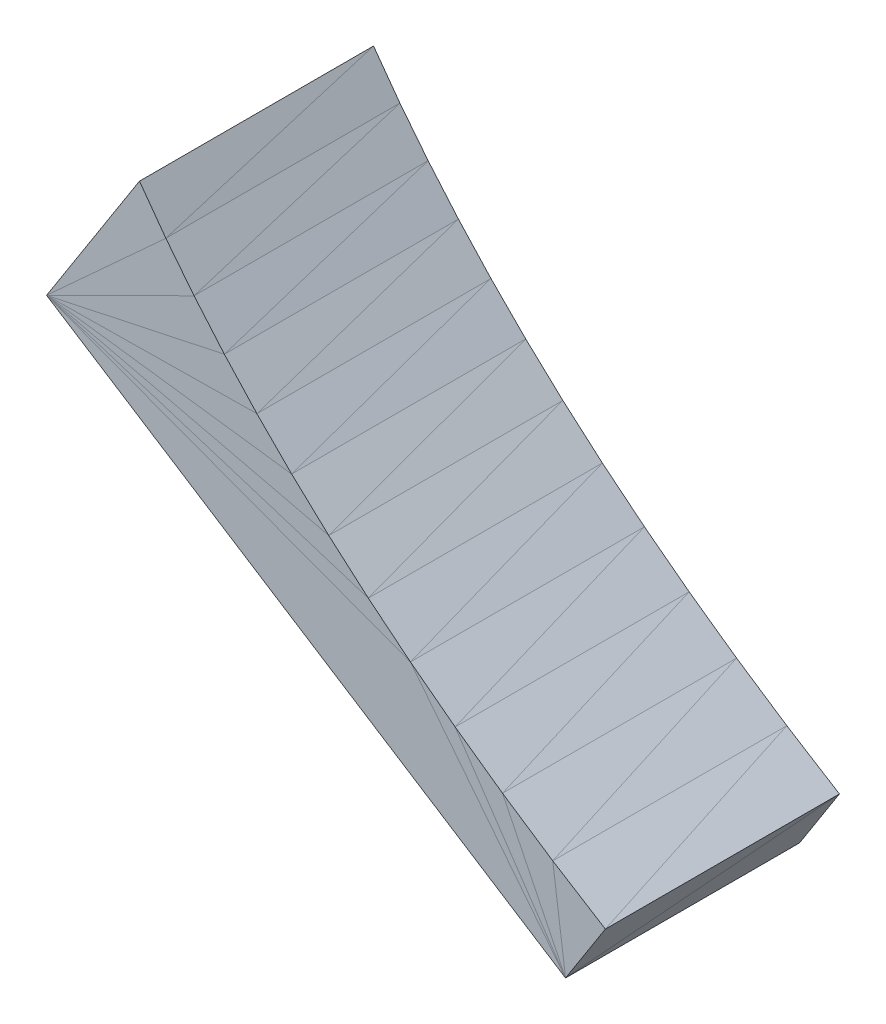
ISO-10303-21;
HEADER;
FILE_DESCRIPTION(('STEP AP214'),'2;1');
FILE_NAME('part.step','',(''),(''),'','','');
FILE_SCHEMA(('AUTOMOTIVE_DESIGN { 1 0 10303 214 1 1 1 1 }'));
ENDSEC;
DATA;
#1=APPLICATION_CONTEXT('core data for automotive mechanical design processes');
#2=APPLICATION_PROTOCOL_DEFINITION('international standard','automotive_design',2000,#1);
#3=PRODUCT_CONTEXT('',#1,'mechanical');
#4=PRODUCT('Part','Part','',(#3));
#5=PRODUCT_RELATED_PRODUCT_CATEGORY('part','',(#4));
#6=PRODUCT_DEFINITION_FORMATION('','',#4);
#7=PRODUCT_DEFINITION_CONTEXT('part definition',#1,'design');
#8=PRODUCT_DEFINITION('design','',#6,#7);
#9=PRODUCT_DEFINITION_SHAPE('','',#8);
#10=(LENGTH_UNIT() NAMED_UNIT(*) SI_UNIT(.MILLI.,.METRE.));
#11=(NAMED_UNIT(*) PLANE_ANGLE_UNIT() SI_UNIT($,.RADIAN.));
#12=(NAMED_UNIT(*) SI_UNIT($,.STERADIAN.) SOLID_ANGLE_UNIT());
#13=UNCERTAINTY_MEASURE_WITH_UNIT(LENGTH_MEASURE(1.E-05),#10,'distance_accuracy_value','');
#14=(GEOMETRIC_REPRESENTATION_CONTEXT(3) GLOBAL_UNCERTAINTY_ASSIGNED_CONTEXT((#13)) GLOBAL_UNIT_ASSIGNED_CONTEXT((#10,
#11,#12)) REPRESENTATION_CONTEXT('',''));
#15=CARTESIAN_POINT('',(0.,0.,0.));
#16=DIRECTION('',(0.,0.,1.));
#17=DIRECTION('',(1.,0.,0.));
#18=AXIS2_PLACEMENT_3D('',#15,#16,#17);
#19=CARTESIAN_POINT('',(0.,0.,9.80002526193857));
#20=DIRECTION('',(0.,0.,-1.));
#21=DIRECTION('',(-1.,0.,0.));
#22=AXIS2_PLACEMENT_3D('',#19,#20,#21);
#23=PLANE('',#22);
#24=DIRECTION('',(-0.562816122617644,0.826582126664763,0.));
#25=VECTOR('',#24,1.);
#26=CARTESIAN_POINT('',(52.4950847029686,22.8988844901323,9.80002526193857));
#27=LINE('',#26,#25);
#28=CARTESIAN_POINT('',(52.4950847029686,22.8988844901323,9.80002526193857));
#29=VERTEX_POINT('',#28);
#30=CARTESIAN_POINT('',(48.0125844478607,29.4821262359619,9.80002526193857));
#31=VERTEX_POINT('',#30);
#32=EDGE_CURVE('E19',#29,#31,#27,.T.);
#33=ORIENTED_EDGE('',*,*,#32,.F.);
#34=DIRECTION('',(0.440328471800176,-0.897836754049489,0.));
#35=VECTOR('',#34,1.);
#36=CARTESIAN_POINT('',(49.9370917677879,28.1146727502346,9.80002526193857));
#37=LINE('',#36,#35);
#38=CARTESIAN_POINT('',(49.9370917677879,28.1146727502346,9.80002526193857));
#39=VERTEX_POINT('',#38);
#40=EDGE_CURVE('E128',#39,#29,#37,.T.);
#41=ORIENTED_EDGE('',*,*,#40,.F.);
#42=DIRECTION('',(0.815172330421562,-0.579218500839778,0.));
#43=VECTOR('',#42,1.);
#44=CARTESIAN_POINT('',(48.0125844478607,29.4821262359619,9.80002526193857));
#45=LINE('',#44,#43);
#46=EDGE_CURVE('E131',#31,#39,#45,.T.);
#47=ORIENTED_EDGE('',*,*,#46,.F.);
#48=EDGE_LOOP('',(#33,#41,#47));
#49=FACE_BOUND('',#48,.T.);
#50=ADVANCED_FACE('F16',(#49),#23,.F.);
#51=CARTESIAN_POINT('',(0.,0.,9.80002526193857));
#52=DIRECTION('',(0.,0.,-1.));
#53=DIRECTION('',(-1.,0.,0.));
#54=AXIS2_PLACEMENT_3D('',#51,#52,#53);
#55=PLANE('',#54);
#56=DIRECTION('',(0.796350239952052,-0.604835758969581,0.));
#57=VECTOR('',#56,1.);
#58=CARTESIAN_POINT('',(46.1983643472195,30.8600440621376,9.80002526193857));
#59=LINE('',#58,#57);
#60=CARTESIAN_POINT('',(46.1983643472195,30.8600440621376,9.80002526193857));
#61=VERTEX_POINT('',#60);
#62=EDGE_CURVE('E138',#61,#31,#59,.T.);
#63=ORIENTED_EDGE('',*,*,#62,.F.);
#64=DIRECTION('',(-0.620347723781328,0.784326909903852,0.));
#65=VECTOR('',#64,1.);
#66=CARTESIAN_POINT('',(52.4950847029686,22.8988844901323,9.80002526193857));
#67=LINE('',#66,#65);
#68=EDGE_CURVE('E135',#29,#61,#67,.T.);
#69=ORIENTED_EDGE('',*,*,#68,.F.);
#70=ORIENTED_EDGE('',*,*,#32,.T.);
#71=EDGE_LOOP('',(#63,#69,#70));
#72=FACE_BOUND('',#71,.T.);
#73=ADVANCED_FACE('F136',(#72),#55,.F.);
#74=CARTESIAN_POINT('',(0.,0.,9.80002526193857));
#75=DIRECTION('',(0.,0.,-1.));
#76=DIRECTION('',(-1.,0.,0.));
#77=AXIS2_PLACEMENT_3D('',#74,#75,#76);
#78=PLANE('',#77);
#79=ORIENTED_EDGE('',*,*,#40,.T.);
#80=DIRECTION('',(0.133329549385269,-0.991071758885663,0.));
#81=VECTOR('',#80,1.);
#82=CARTESIAN_POINT('',(51.9758947193623,26.7581529915333,9.80002526193857));
#83=LINE('',#82,#81);
#84=CARTESIAN_POINT('',(51.9758947193623,26.7581529915333,9.80002526193857));
#85=VERTEX_POINT('',#84);
#86=EDGE_CURVE('E142',#85,#29,#83,.T.);
#87=ORIENTED_EDGE('',*,*,#86,.F.);
#88=DIRECTION('',(0.832555468926433,-0.553941685704089,0.));
#89=VECTOR('',#88,1.);
#90=CARTESIAN_POINT('',(49.9370917677879,28.1146727502346,9.80002526193857));
#91=LINE('',#90,#89);
#92=EDGE_CURVE('E150',#39,#85,#91,.T.);
#93=ORIENTED_EDGE('',*,*,#92,.F.);
#94=EDGE_LOOP('',(#79,#87,#93));
#95=FACE_BOUND('',#94,.T.);
#96=ADVANCED_FACE('F146',(#95),#78,.F.);
#97=CARTESIAN_POINT('',(0.,0.,9.80002526193857));
#98=DIRECTION('',(0.,0.,1.));
#99=DIRECTION('',(1.,0.,0.));
#100=AXIS2_PLACEMENT_3D('',#97,#98,#99);
#101=PLANE('',#100);
#102=ORIENTED_EDGE('',*,*,#68,.T.);
#103=DIRECTION('',(0.937029478100123,-0.349250278699117,0.));
#104=VECTOR('',#103,1.);
#105=CARTESIAN_POINT('',(31.4311720430851,36.3640822470188,9.80002526193857));
#106=LINE('',#105,#104);
#107=CARTESIAN_POINT('',(31.4311720430851,36.3640822470188,9.80002526193857));
#108=VERTEX_POINT('',#107);
#109=EDGE_CURVE('E154',#108,#61,#106,.T.);
#110=ORIENTED_EDGE('',*,*,#109,.F.);
#111=DIRECTION('',(-0.842556528520699,0.538607924419191,0.));
#112=VECTOR('',#111,1.);
#113=CARTESIAN_POINT('',(52.4950847029686,22.8988844901323,9.80002526193857));
#114=LINE('',#113,#112);
#115=EDGE_CURVE('E152',#29,#108,#114,.T.);
#116=ORIENTED_EDGE('',*,*,#115,.F.);
#117=EDGE_LOOP('',(#102,#110,#116));
#118=FACE_BOUND('',#117,.T.);
#119=ADVANCED_FACE('F153',(#118),#101,.T.);
#120=CARTESIAN_POINT('',(0.,0.,9.80002526193857));
#121=DIRECTION('',(0.,0.,1.));
#122=DIRECTION('',(1.,0.,0.));
#123=AXIS2_PLACEMENT_3D('',#120,#121,#122);
#124=PLANE('',#123);
#125=DIRECTION('',(-0.538607657060364,-0.842556699430932,0.));
#126=VECTOR('',#125,1.);
#127=CARTESIAN_POINT('',(54.1109070181847,25.4265535622835,9.80002526193857));
#128=LINE('',#127,#126);
#129=CARTESIAN_POINT('',(54.1109070181847,25.4265535622835,9.80002526193857));
#130=VERTEX_POINT('',#129);
#131=EDGE_CURVE('E158',#130,#29,#128,.T.);
#132=ORIENTED_EDGE('',*,*,#131,.F.);
#133=DIRECTION('',(0.848495063642009,-0.529203294561876,0.));
#134=VECTOR('',#133,1.);
#135=CARTESIAN_POINT('',(51.9758947193623,26.7581529915333,9.80002526193857));
#136=LINE('',#135,#134);
#137=EDGE_CURVE('E166',#85,#130,#136,.T.);
#138=ORIENTED_EDGE('',*,*,#137,.F.);
#139=ORIENTED_EDGE('',*,*,#86,.T.);
#140=EDGE_LOOP('',(#132,#138,#139));
#141=FACE_BOUND('',#140,.T.);
#142=ADVANCED_FACE('F162',(#141),#124,.T.);
#143=CARTESIAN_POINT('',(25.6204334732577,40.078622143745,0.));
#144=DIRECTION('',(0.538607924419191,0.842556528520699,0.));
#145=DIRECTION('',(-0.842556528520699,0.538607924419191,0.));
#146=AXIS2_PLACEMENT_3D('',#143,#144,#145);
#147=PLANE('',#146);
#148=ORIENTED_EDGE('',*,*,#115,.T.);
#149=DIRECTION('',(-0.787608007337806,0.503481843328604,0.35521776449919));
#150=VECTOR('',#149,1.);
#151=CARTESIAN_POINT('',(52.4950847029686,22.8988844901323,0.300025392789394));
#152=LINE('',#151,#150);
#153=CARTESIAN_POINT('',(52.4950847029686,22.8988844901323,0.300025392789393));
#154=VERTEX_POINT('',#153);
#155=EDGE_CURVE('E172',#154,#108,#152,.T.);
#156=ORIENTED_EDGE('',*,*,#155,.F.);
#157=DIRECTION('',(0.,0.,-1.));
#158=VECTOR('',#157,1.);
#159=CARTESIAN_POINT('',(52.4950847029686,22.8988844901323,9.80002526193857));
#160=LINE('',#159,#158);
#161=EDGE_CURVE('E169',#29,#154,#160,.T.);
#162=ORIENTED_EDGE('',*,*,#161,.F.);
#163=EDGE_LOOP('',(#148,#156,#162));
#164=FACE_BOUND('',#163,.T.);
#165=ADVANCED_FACE('F170',(#164),#147,.F.);
#166=CARTESIAN_POINT('',(0.,0.,0.300025392789394));
#167=DIRECTION('',(0.,0.,1.));
#168=DIRECTION('',(1.,0.,0.));
#169=AXIS2_PLACEMENT_3D('',#166,#167,#168);
#170=PLANE('',#169);
#171=DIRECTION('',(0.538607657060364,0.842556699430932,0.));
#172=VECTOR('',#171,1.);
#173=CARTESIAN_POINT('',(52.4950847029686,22.8988844901323,0.300025392789394));
#174=LINE('',#173,#172);
#175=CARTESIAN_POINT('',(54.1109070181847,25.4265535622835,0.300025392789394));
#176=VERTEX_POINT('',#175);
#177=EDGE_CURVE('E175',#154,#176,#174,.T.);
#178=ORIENTED_EDGE('',*,*,#177,.F.);
#179=DIRECTION('',(0.133329549385269,-0.991071758885663,0.));
#180=VECTOR('',#179,1.);
#181=CARTESIAN_POINT('',(51.9758947193623,26.7581529915333,0.300025392789394));
#182=LINE('',#181,#180);
#183=CARTESIAN_POINT('',(51.9758947193623,26.7581529915333,0.300025392789394));
#184=VERTEX_POINT('',#183);
#185=EDGE_CURVE('E229',#184,#154,#182,.T.);
#186=ORIENTED_EDGE('',*,*,#185,.F.);
#187=DIRECTION('',(-0.848495063642009,0.529203294561876,0.));
#188=VECTOR('',#187,1.);
#189=CARTESIAN_POINT('',(54.1109070181847,25.4265535622835,0.300025392789394));
#190=LINE('',#189,#188);
#191=EDGE_CURVE('E120',#176,#184,#190,.T.);
#192=ORIENTED_EDGE('',*,*,#191,.F.);
#193=EDGE_LOOP('',(#178,#186,#192));
#194=FACE_BOUND('',#193,.T.);
#195=ADVANCED_FACE('F873',(#194),#170,.F.);
#196=CARTESIAN_POINT('',(26.8746693988494,-17.1797372556204,0.));
#197=DIRECTION('',(-0.842556699430932,0.538607657060364,0.));
#198=DIRECTION('',(-0.538607657060364,-0.842556699430932,0.));
#199=AXIS2_PLACEMENT_3D('',#196,#197,#198);
#200=PLANE('',#199);
#201=ORIENTED_EDGE('',*,*,#131,.T.);
#202=DIRECTION('',(-0.162191602710239,-0.253720160980994,0.953582699047158));
#203=VECTOR('',#202,1.);
#204=CARTESIAN_POINT('',(54.1109070181847,25.4265535622835,0.300025392789394));
#205=LINE('',#204,#203);
#206=EDGE_CURVE('E180',#176,#29,#205,.T.);
#207=ORIENTED_EDGE('',*,*,#206,.F.);
#208=DIRECTION('',(0.,0.,-1.));
#209=VECTOR('',#208,1.);
#210=CARTESIAN_POINT('',(54.1109070181847,25.4265535622835,9.80002526193857));
#211=LINE('',#210,#209);
#212=EDGE_CURVE('E182',#130,#176,#211,.T.);
#213=ORIENTED_EDGE('',*,*,#212,.F.);
#214=EDGE_LOOP('',(#201,#207,#213));
#215=FACE_BOUND('',#214,.T.);
#216=ADVANCED_FACE('F179',(#215),#200,.F.);
#217=CARTESIAN_POINT('',(26.8746693988494,-17.1797372556204,0.));
#218=DIRECTION('',(0.842556699430932,-0.538607657060364,0.));
#219=DIRECTION('',(0.538607657060364,0.842556699430932,0.));
#220=AXIS2_PLACEMENT_3D('',#217,#218,#219);
#221=PLANE('',#220);
#222=ORIENTED_EDGE('',*,*,#161,.T.);
#223=ORIENTED_EDGE('',*,*,#177,.T.);
#224=ORIENTED_EDGE('',*,*,#206,.T.);
#225=EDGE_LOOP('',(#222,#223,#224));
#226=FACE_BOUND('',#225,.T.);
#227=ADVANCED_FACE('F184',(#226),#221,.T.);
#228=CARTESIAN_POINT('',(26.571284427366,42.6029163138774,0.));
#229=DIRECTION('',(-0.529203294561876,-0.848495063642009,0.));
#230=DIRECTION('',(0.848495063642009,-0.529203294561876,0.));
#231=AXIS2_PLACEMENT_3D('',#228,#229,#230);
#232=PLANE('',#231);
#233=ORIENTED_EDGE('',*,*,#191,.T.);
#234=DIRECTION('',(-0.217246886395359,0.135496095310509,-0.966666746354258));
#235=VECTOR('',#234,1.);
#236=CARTESIAN_POINT('',(54.1109070181847,25.4265535622835,9.80002526193857));
#237=LINE('',#236,#235);
#238=EDGE_CURVE('E191',#130,#184,#237,.T.);
#239=ORIENTED_EDGE('',*,*,#238,.F.);
#240=ORIENTED_EDGE('',*,*,#212,.T.);
#241=EDGE_LOOP('',(#233,#239,#240));
#242=FACE_BOUND('',#241,.T.);
#243=ADVANCED_FACE('F849',(#242),#232,.F.);
#244=CARTESIAN_POINT('',(26.571284427366,42.6029163138774,0.));
#245=DIRECTION('',(-0.529203294561876,-0.848495063642009,0.));
#246=DIRECTION('',(0.848495063642009,-0.529203294561876,0.));
#247=AXIS2_PLACEMENT_3D('',#244,#245,#246);
#248=PLANE('',#247);
#249=ORIENTED_EDGE('',*,*,#238,.T.);
#250=DIRECTION('',(0.,0.,-1.));
#251=VECTOR('',#250,1.);
#252=CARTESIAN_POINT('',(51.9758947193623,26.7581529915333,9.80002526193857));
#253=LINE('',#252,#251);
#254=EDGE_CURVE('E194',#85,#184,#253,.T.);
#255=ORIENTED_EDGE('',*,*,#254,.F.);
#256=ORIENTED_EDGE('',*,*,#137,.T.);
#257=EDGE_LOOP('',(#249,#255,#256));
#258=FACE_BOUND('',#257,.T.);
#259=ADVANCED_FACE('F841',(#258),#248,.F.);
#260=CARTESIAN_POINT('',(0.,0.,9.80002526193857));
#261=DIRECTION('',(0.,0.,1.));
#262=DIRECTION('',(1.,0.,0.));
#263=AXIS2_PLACEMENT_3D('',#260,#261,#262);
#264=PLANE('',#263);
#265=DIRECTION('',(-0.953751117925207,0.300597413589036,0.));
#266=VECTOR('',#265,1.);
#267=CARTESIAN_POINT('',(44.4904379546642,32.248143106699,9.80002526193857));
#268=LINE('',#267,#266);
#269=CARTESIAN_POINT('',(44.4904379546642,32.248143106699,9.80002526193857));
#270=VERTEX_POINT('',#269);
#271=EDGE_CURVE('E210',#270,#108,#268,.T.);
#272=ORIENTED_EDGE('',*,*,#271,.F.);
#273=DIRECTION('',(0.754132166692494,-0.656722677512879,0.));
#274=VECTOR('',#273,1.);
#275=CARTESIAN_POINT('',(42.884960770607,33.6462445557117,9.80002526193857));
#276=LINE('',#275,#274);
#277=CARTESIAN_POINT('',(42.884960770607,33.6462445557117,9.80002526193857));
#278=VERTEX_POINT('',#277);
#279=EDGE_CURVE('E204',#278,#270,#276,.T.);
#280=ORIENTED_EDGE('',*,*,#279,.F.);
#281=DIRECTION('',(0.972983075413399,-0.230876449554918,0.));
#282=VECTOR('',#281,1.);
#283=CARTESIAN_POINT('',(31.4311720430851,36.3640822470188,9.80002526193857));
#284=LINE('',#283,#282);
#285=EDGE_CURVE('E215',#108,#278,#284,.T.);
#286=ORIENTED_EDGE('',*,*,#285,.F.);
#287=EDGE_LOOP('',(#272,#280,#286));
#288=FACE_BOUND('',#287,.T.);
#289=ADVANCED_FACE('F430',(#288),#264,.T.);
#290=CARTESIAN_POINT('',(36.7772674837996,39.354028005181,0.));
#291=DIRECTION('',(-0.682782876973017,-0.73062134030731,0.));
#292=DIRECTION('',(0.73062134030731,-0.682782876973017,0.));
#293=AXIS2_PLACEMENT_3D('',#290,#291,#292);
#294=PLANE('',#293);
#295=DIRECTION('',(0.154990069644716,-0.144841876107474,0.977240456201642));
#296=VECTOR('',#295,1.);
#297=CARTESIAN_POINT('',(41.3782633841038,35.0542888045311,0.300025392789394));
#298=LINE('',#297,#296);
#299=CARTESIAN_POINT('',(41.3782633841038,35.0542888045311,0.300025392789394));
#300=VERTEX_POINT('',#299);
#301=EDGE_CURVE('E201',#300,#278,#298,.T.);
#302=ORIENTED_EDGE('',*,*,#301,.F.);
#303=DIRECTION('',(0.,0.,-1.));
#304=VECTOR('',#303,1.);
#305=CARTESIAN_POINT('',(41.3782633841038,35.0542888045311,9.80002526193857));
#306=LINE('',#305,#304);
#307=CARTESIAN_POINT('',(41.3782633841038,35.0542888045311,9.80002526193857));
#308=VERTEX_POINT('',#307);
#309=EDGE_CURVE('E218',#308,#300,#306,.T.);
#310=ORIENTED_EDGE('',*,*,#309,.F.);
#311=DIRECTION('',(-0.73062134030731,0.682782876973017,0.));
#312=VECTOR('',#311,1.);
#313=CARTESIAN_POINT('',(42.884960770607,33.6462445557117,9.80002526193857));
#314=LINE('',#313,#312);
#315=EDGE_CURVE('E213',#278,#308,#314,.T.);
#316=ORIENTED_EDGE('',*,*,#315,.F.);
#317=EDGE_LOOP('',(#302,#310,#316));
#318=FACE_BOUND('',#317,.T.);
#319=ADVANCED_FACE('F824',(#318),#294,.F.);
#320=CARTESIAN_POINT('',(28.2893927189361,42.5179928295546,0.));
#321=DIRECTION('',(-0.553941685704089,-0.832555468926433,0.));
#322=DIRECTION('',(0.832555468926433,-0.553941685704089,0.));
#323=AXIS2_PLACEMENT_3D('',#320,#321,#322);
#324=PLANE('',#323);
#325=DIRECTION('',(0.832555468926433,-0.553941685704089,0.));
#326=VECTOR('',#325,1.);
#327=CARTESIAN_POINT('',(49.9370917677879,28.1146727502346,0.300025392789394));
#328=LINE('',#327,#326);
#329=CARTESIAN_POINT('',(49.9370917677879,28.1146727502346,0.300025392789394));
#330=VERTEX_POINT('',#329);
#331=EDGE_CURVE('E226',#330,#184,#328,.T.);
#332=ORIENTED_EDGE('',*,*,#331,.F.);
#333=DIRECTION('',(-0.207817428601511,0.13827155188429,-0.968345441621411));
#334=VECTOR('',#333,1.);
#335=CARTESIAN_POINT('',(51.9758947193623,26.7581529915333,9.80002526193857));
#336=LINE('',#335,#334);
#337=EDGE_CURVE('E198',#85,#330,#336,.T.);
#338=ORIENTED_EDGE('',*,*,#337,.F.);
#339=ORIENTED_EDGE('',*,*,#254,.T.);
#340=EDGE_LOOP('',(#332,#338,#339));
#341=FACE_BOUND('',#340,.T.);
#342=ADVANCED_FACE('F815',(#341),#324,.F.);
#343=CARTESIAN_POINT('',(28.2893927189361,42.5179928295546,0.));
#344=DIRECTION('',(-0.553941685704089,-0.832555468926433,0.));
#345=DIRECTION('',(0.832555468926433,-0.553941685704089,0.));
#346=AXIS2_PLACEMENT_3D('',#343,#344,#345);
#347=PLANE('',#346);
#348=ORIENTED_EDGE('',*,*,#337,.T.);
#349=DIRECTION('',(0.,0.,-1.));
#350=VECTOR('',#349,1.);
#351=CARTESIAN_POINT('',(49.9370917677879,28.1146727502346,9.80002526193857));
#352=LINE('',#351,#350);
#353=EDGE_CURVE('E232',#39,#330,#352,.T.);
#354=ORIENTED_EDGE('',*,*,#353,.F.);
#355=ORIENTED_EDGE('',*,*,#92,.T.);
#356=EDGE_LOOP('',(#348,#354,#355));
#357=FACE_BOUND('',#356,.T.);
#358=ADVANCED_FACE('F806',(#357),#347,.F.);
#359=CARTESIAN_POINT('',(36.7772674837997,39.354028005181,0.));
#360=DIRECTION('',(-0.682782876973017,-0.73062134030731,0.));
#361=DIRECTION('',(0.73062134030731,-0.682782876973017,0.));
#362=AXIS2_PLACEMENT_3D('',#359,#360,#361);
#363=PLANE('',#362);
#364=DIRECTION('',(0.73062134030731,-0.682782876973017,0.));
#365=VECTOR('',#364,1.);
#366=CARTESIAN_POINT('',(41.3782633841038,35.0542888045311,0.300025392789394));
#367=LINE('',#366,#365);
#368=CARTESIAN_POINT('',(42.884960770607,33.6462445557117,0.300025392789394));
#369=VERTEX_POINT('',#368);
#370=EDGE_CURVE('E239',#300,#369,#367,.T.);
#371=ORIENTED_EDGE('',*,*,#370,.F.);
#372=ORIENTED_EDGE('',*,*,#301,.T.);
#373=DIRECTION('',(0.,0.,1.));
#374=VECTOR('',#373,1.);
#375=CARTESIAN_POINT('',(42.884960770607,33.6462445557117,0.300025392789394));
#376=LINE('',#375,#374);
#377=EDGE_CURVE('E205',#369,#278,#376,.T.);
#378=ORIENTED_EDGE('',*,*,#377,.F.);
#379=EDGE_LOOP('',(#371,#372,#378));
#380=FACE_BOUND('',#379,.T.);
#381=ADVANCED_FACE('F798',(#380),#363,.F.);
#382=CARTESIAN_POINT('',(35.1591206306173,40.3741559840534,0.));
#383=DIRECTION('',(-0.656722677512879,-0.754132166692494,0.));
#384=DIRECTION('',(0.754132166692494,-0.656722677512879,0.));
#385=AXIS2_PLACEMENT_3D('',#382,#383,#384);
#386=PLANE('',#385);
#387=DIRECTION('',(0.164907591571215,-0.143606863441231,0.975798419252026));
#388=VECTOR('',#387,1.);
#389=CARTESIAN_POINT('',(42.884960770607,33.6462445557117,0.300025392789394));
#390=LINE('',#389,#388);
#391=EDGE_CURVE('E242',#369,#270,#390,.T.);
#392=ORIENTED_EDGE('',*,*,#391,.F.);
#393=ORIENTED_EDGE('',*,*,#377,.T.);
#394=ORIENTED_EDGE('',*,*,#279,.T.);
#395=EDGE_LOOP('',(#392,#393,#394));
#396=FACE_BOUND('',#395,.T.);
#397=ADVANCED_FACE('F790',(#396),#386,.F.);
#398=CARTESIAN_POINT('',(0.,0.,9.80002526193857));
#399=DIRECTION('',(0.,0.,1.));
#400=DIRECTION('',(1.,0.,0.));
#401=AXIS2_PLACEMENT_3D('',#398,#399,#400);
#402=PLANE('',#401);
#403=DIRECTION('',(0.776023075166139,-0.630704516243295,0.));
#404=VECTOR('',#403,1.);
#405=CARTESIAN_POINT('',(44.4904379546642,32.248143106699,9.80002526193857));
#406=LINE('',#405,#404);
#407=EDGE_CURVE('E246',#270,#61,#406,.T.);
#408=ORIENTED_EDGE('',*,*,#407,.F.);
#409=ORIENTED_EDGE('',*,*,#271,.T.);
#410=ORIENTED_EDGE('',*,*,#109,.T.);
#411=EDGE_LOOP('',(#408,#409,#410));
#412=FACE_BOUND('',#411,.T.);
#413=ADVANCED_FACE('F433',(#412),#402,.T.);
#414=CARTESIAN_POINT('',(0.,0.,9.80002526193857));
#415=DIRECTION('',(0.,0.,-1.));
#416=DIRECTION('',(-1.,0.,0.));
#417=AXIS2_PLACEMENT_3D('',#414,#415,#416);
#418=PLANE('',#417);
#419=DIRECTION('',(0.991441842566592,-0.130549120288733,0.));
#420=VECTOR('',#419,1.);
#421=CARTESIAN_POINT('',(31.4311720430851,36.3640822470188,9.80002526193857));
#422=LINE('',#421,#420);
#423=EDGE_CURVE('E253',#108,#308,#422,.T.);
#424=ORIENTED_EDGE('',*,*,#423,.F.);
#425=ORIENTED_EDGE('',*,*,#285,.T.);
#426=ORIENTED_EDGE('',*,*,#315,.T.);
#427=EDGE_LOOP('',(#424,#425,#426));
#428=FACE_BOUND('',#427,.T.);
#429=ADVANCED_FACE('F427',(#428),#418,.F.);
#430=CARTESIAN_POINT('',(38.3126763068252,38.1342217370074,0.));
#431=DIRECTION('',(-0.708755491784293,-0.70545421741287,0.));
#432=DIRECTION('',(0.70545421741287,-0.708755491784293,0.));
#433=AXIS2_PLACEMENT_3D('',#430,#431,#432);
#434=PLANE('',#433);
#435=DIRECTION('',(0.70545421741287,-0.708755491784293,0.));
#436=VECTOR('',#435,1.);
#437=CARTESIAN_POINT('',(39.966844022274,36.47231310606,0.300025392789394));
#438=LINE('',#437,#436);
#439=CARTESIAN_POINT('',(39.966844022274,36.47231310606,0.300025392789394));
#440=VERTEX_POINT('',#439);
#441=EDGE_CURVE('E256',#440,#300,#438,.T.);
#442=ORIENTED_EDGE('',*,*,#441,.F.);
#443=DIRECTION('',(-0.14538135804653,0.146061691000186,-0.978534742947185));
#444=VECTOR('',#443,1.);
#445=CARTESIAN_POINT('',(41.3782633841038,35.0542888045311,9.80002526193857));
#446=LINE('',#445,#444);
#447=EDGE_CURVE('E223',#308,#440,#446,.T.);
#448=ORIENTED_EDGE('',*,*,#447,.F.);
#449=ORIENTED_EDGE('',*,*,#309,.T.);
#450=EDGE_LOOP('',(#442,#448,#449));
#451=FACE_BOUND('',#450,.T.);
#452=ADVANCED_FACE('F766',(#451),#434,.F.);
#453=CARTESIAN_POINT('',(38.3126763068252,38.1342217370074,0.));
#454=DIRECTION('',(-0.708755491784293,-0.70545421741287,0.));
#455=DIRECTION('',(0.70545421741287,-0.708755491784293,0.));
#456=AXIS2_PLACEMENT_3D('',#453,#454,#455);
#457=PLANE('',#456);
#458=ORIENTED_EDGE('',*,*,#447,.T.);
#459=DIRECTION('',(0.,0.,-1.));
#460=VECTOR('',#459,1.);
#461=CARTESIAN_POINT('',(39.966844022274,36.47231310606,9.80002526193857));
#462=LINE('',#461,#460);
#463=CARTESIAN_POINT('',(39.966844022274,36.47231310606,9.80002526193857));
#464=VERTEX_POINT('',#463);
#465=EDGE_CURVE('E264',#464,#440,#462,.T.);
#466=ORIENTED_EDGE('',*,*,#465,.F.);
#467=DIRECTION('',(-0.70545421741287,0.708755491784293,0.));
#468=VECTOR('',#467,1.);
#469=CARTESIAN_POINT('',(41.3782633841038,35.0542888045311,9.80002526193857));
#470=LINE('',#469,#468);
#471=EDGE_CURVE('E250',#308,#464,#470,.T.);
#472=ORIENTED_EDGE('',*,*,#471,.F.);
#473=EDGE_LOOP('',(#458,#466,#472));
#474=FACE_BOUND('',#473,.T.);
#475=ADVANCED_FACE('F757',(#474),#457,.F.);
#476=CARTESIAN_POINT('',(0.,0.,0.300025392789394));
#477=DIRECTION('',(0.,0.,1.));
#478=DIRECTION('',(1.,0.,0.));
#479=AXIS2_PLACEMENT_3D('',#476,#477,#478);
#480=PLANE('',#479);
#481=ORIENTED_EDGE('',*,*,#185,.T.);
#482=DIRECTION('',(0.440328471800176,-0.897836754049489,0.));
#483=VECTOR('',#482,1.);
#484=CARTESIAN_POINT('',(49.9370917677879,28.1146727502346,0.300025392789394));
#485=LINE('',#484,#483);
#486=EDGE_CURVE('E268',#330,#154,#485,.T.);
#487=ORIENTED_EDGE('',*,*,#486,.F.);
#488=ORIENTED_EDGE('',*,*,#331,.T.);
#489=EDGE_LOOP('',(#481,#487,#488));
#490=FACE_BOUND('',#489,.T.);
#491=ADVANCED_FACE('F748',(#490),#480,.F.);
#492=CARTESIAN_POINT('',(30.0283035288103,42.2608085389135,0.));
#493=DIRECTION('',(-0.579218500839778,-0.815172330421562,0.));
#494=DIRECTION('',(0.815172330421562,-0.579218500839778,0.));
#495=AXIS2_PLACEMENT_3D('',#492,#493,#494);
#496=PLANE('',#495);
#497=DIRECTION('',(0.815172330421562,-0.579218500839778,0.));
#498=VECTOR('',#497,1.);
#499=CARTESIAN_POINT('',(48.0125844478607,29.4821262359619,0.300025392789394));
#500=LINE('',#499,#498);
#501=CARTESIAN_POINT('',(48.0125844478607,29.4821262359619,0.300025392789394));
#502=VERTEX_POINT('',#501);
#503=EDGE_CURVE('E271',#502,#330,#500,.T.);
#504=ORIENTED_EDGE('',*,*,#503,.F.);
#505=DIRECTION('',(-0.196599858665224,0.139693499339573,-0.970481438161019));
#506=VECTOR('',#505,1.);
#507=CARTESIAN_POINT('',(49.9370917677879,28.1146727502346,9.80002526193857));
#508=LINE('',#507,#506);
#509=EDGE_CURVE('E236',#39,#502,#508,.T.);
#510=ORIENTED_EDGE('',*,*,#509,.F.);
#511=ORIENTED_EDGE('',*,*,#353,.T.);
#512=EDGE_LOOP('',(#504,#510,#511));
#513=FACE_BOUND('',#512,.T.);
#514=ADVANCED_FACE('F739',(#513),#496,.F.);
#515=CARTESIAN_POINT('',(30.0283035288103,42.2608085389135,0.));
#516=DIRECTION('',(-0.579218500839778,-0.815172330421562,0.));
#517=DIRECTION('',(0.815172330421562,-0.579218500839778,0.));
#518=AXIS2_PLACEMENT_3D('',#515,#516,#517);
#519=PLANE('',#518);
#520=ORIENTED_EDGE('',*,*,#509,.T.);
#521=DIRECTION('',(0.,0.,-1.));
#522=VECTOR('',#521,1.);
#523=CARTESIAN_POINT('',(48.0125844478607,29.4821262359619,9.80002526193857));
#524=LINE('',#523,#522);
#525=EDGE_CURVE('E274',#31,#502,#524,.T.);
#526=ORIENTED_EDGE('',*,*,#525,.F.);
#527=ORIENTED_EDGE('',*,*,#46,.T.);
#528=EDGE_LOOP('',(#520,#526,#527));
#529=FACE_BOUND('',#528,.T.);
#530=ADVANCED_FACE('F730',(#529),#519,.F.);
#531=CARTESIAN_POINT('',(0.,0.,0.300025392789394));
#532=DIRECTION('',(0.,0.,1.));
#533=DIRECTION('',(1.,0.,0.));
#534=AXIS2_PLACEMENT_3D('',#531,#532,#533);
#535=PLANE('',#534);
#536=DIRECTION('',(0.972983075413399,-0.230876449554918,0.));
#537=VECTOR('',#536,1.);
#538=CARTESIAN_POINT('',(31.4311720430851,36.3640822470188,0.300025392789394));
#539=LINE('',#538,#537);
#540=CARTESIAN_POINT('',(31.4311720430851,36.3640822470188,0.300025392789394));
#541=VERTEX_POINT('',#540);
#542=EDGE_CURVE('E280',#541,#369,#539,.T.);
#543=ORIENTED_EDGE('',*,*,#542,.F.);
#544=DIRECTION('',(-0.991441842566592,0.130549120288733,0.));
#545=VECTOR('',#544,1.);
#546=CARTESIAN_POINT('',(41.3782633841038,35.0542888045311,0.300025392789394));
#547=LINE('',#546,#545);
#548=EDGE_CURVE('E261',#300,#541,#547,.T.);
#549=ORIENTED_EDGE('',*,*,#548,.F.);
#550=ORIENTED_EDGE('',*,*,#370,.T.);
#551=EDGE_LOOP('',(#543,#549,#550));
#552=FACE_BOUND('',#551,.T.);
#553=ADVANCED_FACE('F722',(#552),#535,.F.);
#554=CARTESIAN_POINT('',(35.1591206306173,40.3741559840534,0.));
#555=DIRECTION('',(-0.656722677512879,-0.754132166692494,0.));
#556=DIRECTION('',(0.754132166692494,-0.656722677512879,0.));
#557=AXIS2_PLACEMENT_3D('',#554,#555,#556);
#558=PLANE('',#557);
#559=DIRECTION('',(0.754132166692494,-0.656722677512879,0.));
#560=VECTOR('',#559,1.);
#561=CARTESIAN_POINT('',(42.884960770607,33.6462445557117,0.300025392789394));
#562=LINE('',#561,#560);
#563=CARTESIAN_POINT('',(44.4904379546642,32.248143106699,0.300025392789394));
#564=VERTEX_POINT('',#563);
#565=EDGE_CURVE('E285',#369,#564,#562,.T.);
#566=ORIENTED_EDGE('',*,*,#565,.F.);
#567=ORIENTED_EDGE('',*,*,#391,.T.);
#568=DIRECTION('',(0.,0.,1.));
#569=VECTOR('',#568,1.);
#570=CARTESIAN_POINT('',(44.4904379546642,32.248143106699,0.300025392789394));
#571=LINE('',#570,#569);
#572=EDGE_CURVE('E247',#564,#270,#571,.T.);
#573=ORIENTED_EDGE('',*,*,#572,.F.);
#574=EDGE_LOOP('',(#566,#567,#573));
#575=FACE_BOUND('',#574,.T.);
#576=ADVANCED_FACE('F440',(#575),#558,.F.);
#577=CARTESIAN_POINT('',(31.7646593035355,41.8225835414567,0.));
#578=DIRECTION('',(-0.604835758969581,-0.796350239952052,0.));
#579=DIRECTION('',(0.796350239952052,-0.604835758969581,0.));
#580=AXIS2_PLACEMENT_3D('',#577,#578,#579);
#581=PLANE('',#580);
#582=DIRECTION('',(0.18570544861319,-0.141045095890858,0.972429826404205));
#583=VECTOR('',#582,1.);
#584=CARTESIAN_POINT('',(46.1983643472195,30.8600440621376,0.300025392789394));
#585=LINE('',#584,#583);
#586=CARTESIAN_POINT('',(46.1983643472195,30.8600440621376,0.300025392789394));
#587=VERTEX_POINT('',#586);
#588=EDGE_CURVE('E277',#587,#31,#585,.T.);
#589=ORIENTED_EDGE('',*,*,#588,.F.);
#590=DIRECTION('',(0.,0.,-1.));
#591=VECTOR('',#590,1.);
#592=CARTESIAN_POINT('',(46.1983643472195,30.8600440621376,9.80002526193857));
#593=LINE('',#592,#591);
#594=EDGE_CURVE('E288',#61,#587,#593,.T.);
#595=ORIENTED_EDGE('',*,*,#594,.F.);
#596=ORIENTED_EDGE('',*,*,#62,.T.);
#597=EDGE_LOOP('',(#589,#595,#596));
#598=FACE_BOUND('',#597,.T.);
#599=ADVANCED_FACE('F706',(#598),#581,.F.);
#600=CARTESIAN_POINT('',(33.4813423816367,41.1956686634306,0.));
#601=DIRECTION('',(-0.630704516243295,-0.776023075166139,0.));
#602=DIRECTION('',(0.776023075166139,-0.630704516243295,0.));
#603=AXIS2_PLACEMENT_3D('',#600,#601,#602);
#604=PLANE('',#603);
#605=DIRECTION('',(0.175143079781094,-0.142345678809933,0.974198444532187));
#606=VECTOR('',#605,1.);
#607=CARTESIAN_POINT('',(44.4904379546642,32.248143106699,0.300025392789394));
#608=LINE('',#607,#606);
#609=EDGE_CURVE('E289',#564,#61,#608,.T.);
#610=ORIENTED_EDGE('',*,*,#609,.F.);
#611=ORIENTED_EDGE('',*,*,#572,.T.);
#612=ORIENTED_EDGE('',*,*,#407,.T.);
#613=EDGE_LOOP('',(#610,#611,#612));
#614=FACE_BOUND('',#613,.T.);
#615=ADVANCED_FACE('F442',(#614),#604,.F.);
#616=CARTESIAN_POINT('',(0.,0.,9.80002526193857));
#617=DIRECTION('',(0.,0.,-1.));
#618=DIRECTION('',(-1.,0.,0.));
#619=AXIS2_PLACEMENT_3D('',#616,#617,#618);
#620=PLANE('',#619);
#621=DIRECTION('',(0.999919620663614,0.0126788095630253,0.));
#622=VECTOR('',#621,1.);
#623=CARTESIAN_POINT('',(31.4311720430851,36.3640822470188,9.80002526193857));
#624=LINE('',#623,#622);
#625=EDGE_CURVE('E297',#108,#464,#624,.T.);
#626=ORIENTED_EDGE('',*,*,#625,.F.);
#627=ORIENTED_EDGE('',*,*,#423,.T.);
#628=ORIENTED_EDGE('',*,*,#471,.T.);
#629=EDGE_LOOP('',(#626,#627,#628));
#630=FACE_BOUND('',#629,.T.);
#631=ADVANCED_FACE('F423',(#630),#620,.F.);
#632=CARTESIAN_POINT('',(39.7413090717316,36.7164287372432,0.));
#633=DIRECTION('',(-0.734507282695571,-0.67860080435199,0.));
#634=DIRECTION('',(0.678600804351991,-0.734507282695571,0.));
#635=AXIS2_PLACEMENT_3D('',#632,#633,#634);
#636=PLANE('',#635);
#637=DIRECTION('',(0.136070170240605,-0.147280301406052,0.979690472337276));
#638=VECTOR('',#637,1.);
#639=CARTESIAN_POINT('',(38.6473797261715,37.9004813730717,0.300025392789394));
#640=LINE('',#639,#638);
#641=CARTESIAN_POINT('',(38.6473797261715,37.9004813730717,0.300025392789394));
#642=VERTEX_POINT('',#641);
#643=EDGE_CURVE('E265',#642,#464,#640,.T.);
#644=ORIENTED_EDGE('',*,*,#643,.F.);
#645=DIRECTION('',(0.,0.,-1.));
#646=VECTOR('',#645,1.);
#647=CARTESIAN_POINT('',(38.6473797261715,37.9004813730717,9.80002526193857));
#648=LINE('',#647,#646);
#649=CARTESIAN_POINT('',(38.6473797261715,37.9004813730717,9.80002526193857));
#650=VERTEX_POINT('',#649);
#651=EDGE_CURVE('E300',#650,#642,#648,.T.);
#652=ORIENTED_EDGE('',*,*,#651,.F.);
#653=DIRECTION('',(-0.678600804351991,0.734507282695571,0.));
#654=VECTOR('',#653,1.);
#655=CARTESIAN_POINT('',(39.966844022274,36.47231310606,9.80002526193857));
#656=LINE('',#655,#654);
#657=EDGE_CURVE('E292',#464,#650,#656,.T.);
#658=ORIENTED_EDGE('',*,*,#657,.F.);
#659=EDGE_LOOP('',(#644,#652,#658));
#660=FACE_BOUND('',#659,.T.);
#661=ADVANCED_FACE('F682',(#660),#636,.F.);
#662=CARTESIAN_POINT('',(0.,0.,0.300025392789394));
#663=DIRECTION('',(0.,0.,1.));
#664=DIRECTION('',(1.,0.,0.));
#665=AXIS2_PLACEMENT_3D('',#662,#663,#664);
#666=PLANE('',#665);
#667=ORIENTED_EDGE('',*,*,#548,.T.);
#668=DIRECTION('',(-0.999919620663614,-0.0126788095630253,0.));
#669=VECTOR('',#668,1.);
#670=CARTESIAN_POINT('',(39.966844022274,36.47231310606,0.300025392789394));
#671=LINE('',#670,#669);
#672=EDGE_CURVE('E304',#440,#541,#671,.T.);
#673=ORIENTED_EDGE('',*,*,#672,.F.);
#674=ORIENTED_EDGE('',*,*,#441,.T.);
#675=EDGE_LOOP('',(#667,#673,#674));
#676=FACE_BOUND('',#675,.T.);
#677=ADVANCED_FACE('F673',(#676),#666,.F.);
#678=CARTESIAN_POINT('',(39.7413090717316,36.7164287372432,0.));
#679=DIRECTION('',(-0.734507282695571,-0.678600804351991,0.));
#680=DIRECTION('',(0.678600804351991,-0.734507282695571,0.));
#681=AXIS2_PLACEMENT_3D('',#678,#679,#680);
#682=PLANE('',#681);
#683=DIRECTION('',(0.678600804351991,-0.734507282695571,0.));
#684=VECTOR('',#683,1.);
#685=CARTESIAN_POINT('',(38.6473797261715,37.9004813730717,0.300025392789394));
#686=LINE('',#685,#684);
#687=EDGE_CURVE('E307',#642,#440,#686,.T.);
#688=ORIENTED_EDGE('',*,*,#687,.F.);
#689=ORIENTED_EDGE('',*,*,#643,.T.);
#690=ORIENTED_EDGE('',*,*,#465,.T.);
#691=EDGE_LOOP('',(#688,#689,#690));
#692=FACE_BOUND('',#691,.T.);
#693=ADVANCED_FACE('F664',(#692),#682,.F.);
#694=CARTESIAN_POINT('',(0.,0.,0.300025392789394));
#695=DIRECTION('',(0.,0.,-1.));
#696=DIRECTION('',(-1.,0.,0.));
#697=AXIS2_PLACEMENT_3D('',#694,#695,#696);
#698=PLANE('',#697);
#699=DIRECTION('',(0.562816122617644,-0.826582126664763,0.));
#700=VECTOR('',#699,1.);
#701=CARTESIAN_POINT('',(48.0125844478607,29.4821262359619,0.300025392789394));
#702=LINE('',#701,#700);
#703=EDGE_CURVE('E310',#502,#154,#702,.T.);
#704=ORIENTED_EDGE('',*,*,#703,.F.);
#705=ORIENTED_EDGE('',*,*,#503,.T.);
#706=ORIENTED_EDGE('',*,*,#486,.T.);
#707=EDGE_LOOP('',(#704,#705,#706));
#708=FACE_BOUND('',#707,.T.);
#709=ADVANCED_FACE('F655',(#708),#698,.T.);
#710=CARTESIAN_POINT('',(31.7646593035355,41.8225835414568,0.));
#711=DIRECTION('',(-0.604835758969581,-0.796350239952052,0.));
#712=DIRECTION('',(0.796350239952052,-0.604835758969581,0.));
#713=AXIS2_PLACEMENT_3D('',#710,#711,#712);
#714=PLANE('',#713);
#715=DIRECTION('',(0.796350239952052,-0.604835758969581,0.));
#716=VECTOR('',#715,1.);
#717=CARTESIAN_POINT('',(46.1983643472195,30.8600440621376,0.300025392789394));
#718=LINE('',#717,#716);
#719=EDGE_CURVE('E315',#587,#502,#718,.T.);
#720=ORIENTED_EDGE('',*,*,#719,.F.);
#721=ORIENTED_EDGE('',*,*,#588,.T.);
#722=ORIENTED_EDGE('',*,*,#525,.T.);
#723=EDGE_LOOP('',(#720,#721,#722));
#724=FACE_BOUND('',#723,.T.);
#725=ADVANCED_FACE('F647',(#724),#714,.F.);
#726=CARTESIAN_POINT('',(0.,0.,0.300025392789394));
#727=DIRECTION('',(0.,0.,1.));
#728=DIRECTION('',(1.,0.,0.));
#729=AXIS2_PLACEMENT_3D('',#726,#727,#728);
#730=PLANE('',#729);
#731=ORIENTED_EDGE('',*,*,#565,.T.);
#732=DIRECTION('',(0.953751117925207,-0.300597413589036,0.));
#733=VECTOR('',#732,1.);
#734=CARTESIAN_POINT('',(31.4311720430851,36.3640822470188,0.300025392789394));
#735=LINE('',#734,#733);
#736=EDGE_CURVE('E318',#541,#564,#735,.T.);
#737=ORIENTED_EDGE('',*,*,#736,.F.);
#738=ORIENTED_EDGE('',*,*,#542,.T.);
#739=EDGE_LOOP('',(#731,#737,#738));
#740=FACE_BOUND('',#739,.T.);
#741=ADVANCED_FACE('F447',(#740),#730,.F.);
#742=CARTESIAN_POINT('',(33.4813423816367,41.1956686634306,0.));
#743=DIRECTION('',(-0.630704516243295,-0.776023075166139,0.));
#744=DIRECTION('',(0.776023075166139,-0.630704516243295,0.));
#745=AXIS2_PLACEMENT_3D('',#742,#743,#744);
#746=PLANE('',#745);
#747=DIRECTION('',(0.776023075166139,-0.630704516243295,0.));
#748=VECTOR('',#747,1.);
#749=CARTESIAN_POINT('',(44.4904379546642,32.248143106699,0.300025392789394));
#750=LINE('',#749,#748);
#751=EDGE_CURVE('E321',#564,#587,#750,.T.);
#752=ORIENTED_EDGE('',*,*,#751,.F.);
#753=ORIENTED_EDGE('',*,*,#609,.T.);
#754=ORIENTED_EDGE('',*,*,#594,.T.);
#755=EDGE_LOOP('',(#752,#753,#754));
#756=FACE_BOUND('',#755,.T.);
#757=ADVANCED_FACE('F448',(#756),#746,.F.);
#758=CARTESIAN_POINT('',(0.,0.,9.80002526193857));
#759=DIRECTION('',(0.,0.,1.));
#760=DIRECTION('',(1.,0.,0.));
#761=AXIS2_PLACEMENT_3D('',#758,#759,#760);
#762=PLANE('',#761);
#763=ORIENTED_EDGE('',*,*,#625,.T.);
#764=ORIENTED_EDGE('',*,*,#657,.T.);
#765=DIRECTION('',(0.978077343233571,0.208241952193017,0.));
#766=VECTOR('',#765,1.);
#767=CARTESIAN_POINT('',(31.4311720430851,36.3640822470188,9.80002526193857));
#768=LINE('',#767,#766);
#769=EDGE_CURVE('E325',#108,#650,#768,.T.);
#770=ORIENTED_EDGE('',*,*,#769,.F.);
#771=EDGE_LOOP('',(#763,#764,#770));
#772=FACE_BOUND('',#771,.T.);
#773=ADVANCED_FACE('F419',(#772),#762,.T.);
#774=CARTESIAN_POINT('',(41.0378977625621,35.1060380144513,0.));
#775=DIRECTION('',(-0.759890327357357,-0.650051298274781,0.));
#776=DIRECTION('',(0.650051298274781,-0.759890327357357,0.));
#777=AXIS2_PLACEMENT_3D('',#774,#775,#776);
#778=PLANE('',#777);
#779=DIRECTION('',(0.127043646829552,-0.148510184710335,0.980716389603819));
#780=VECTOR('',#779,1.);
#781=CARTESIAN_POINT('',(37.4167338013649,39.3390692770481,0.300025392789394));
#782=LINE('',#781,#780);
#783=CARTESIAN_POINT('',(37.4167338013649,39.3390692770481,0.300025392789394));
#784=VERTEX_POINT('',#783);
#785=EDGE_CURVE('E301',#784,#650,#782,.T.);
#786=ORIENTED_EDGE('',*,*,#785,.F.);
#787=DIRECTION('',(0.,0.,-1.));
#788=VECTOR('',#787,1.);
#789=CARTESIAN_POINT('',(37.4167338013649,39.3390692770481,9.80002526193857));
#790=LINE('',#789,#788);
#791=CARTESIAN_POINT('',(37.4167338013649,39.3390692770481,9.80002526193857));
#792=VERTEX_POINT('',#791);
#793=EDGE_CURVE('E328',#792,#784,#790,.T.);
#794=ORIENTED_EDGE('',*,*,#793,.F.);
#795=DIRECTION('',(-0.650051298274781,0.759890327357357,0.));
#796=VECTOR('',#795,1.);
#797=CARTESIAN_POINT('',(38.6473797261715,37.9004813730717,9.80002526193857));
#798=LINE('',#797,#796);
#799=EDGE_CURVE('E324',#650,#792,#798,.T.);
#800=ORIENTED_EDGE('',*,*,#799,.F.);
#801=EDGE_LOOP('',(#786,#794,#800));
#802=FACE_BOUND('',#801,.T.);
#803=ADVANCED_FACE('F616',(#802),#778,.F.);
#804=CARTESIAN_POINT('',(41.0378977625621,35.1060380144513,0.));
#805=DIRECTION('',(-0.759890327357357,-0.650051298274781,0.));
#806=DIRECTION('',(0.650051298274781,-0.759890327357357,0.));
#807=AXIS2_PLACEMENT_3D('',#804,#805,#806);
#808=PLANE('',#807);
#809=DIRECTION('',(0.650051298274781,-0.759890327357357,0.));
#810=VECTOR('',#809,1.);
#811=CARTESIAN_POINT('',(37.4167338013649,39.3390692770481,0.300025392789394));
#812=LINE('',#811,#810);
#813=EDGE_CURVE('E333',#784,#642,#812,.T.);
#814=ORIENTED_EDGE('',*,*,#813,.F.);
#815=ORIENTED_EDGE('',*,*,#785,.T.);
#816=ORIENTED_EDGE('',*,*,#651,.T.);
#817=EDGE_LOOP('',(#814,#815,#816));
#818=FACE_BOUND('',#817,.T.);
#819=ADVANCED_FACE('F608',(#818),#808,.F.);
#820=CARTESIAN_POINT('',(0.,0.,0.300025392789394));
#821=DIRECTION('',(0.,0.,-1.));
#822=DIRECTION('',(-1.,0.,0.));
#823=AXIS2_PLACEMENT_3D('',#820,#821,#822);
#824=PLANE('',#823);
#825=DIRECTION('',(-0.978077343233571,-0.208241952193017,0.));
#826=VECTOR('',#825,1.);
#827=CARTESIAN_POINT('',(38.6473797261715,37.9004813730717,0.300025392789394));
#828=LINE('',#827,#826);
#829=EDGE_CURVE('E336',#642,#541,#828,.T.);
#830=ORIENTED_EDGE('',*,*,#829,.F.);
#831=ORIENTED_EDGE('',*,*,#687,.T.);
#832=ORIENTED_EDGE('',*,*,#672,.T.);
#833=EDGE_LOOP('',(#830,#831,#832));
#834=FACE_BOUND('',#833,.T.);
#835=ADVANCED_FACE('F599',(#834),#824,.T.);
#836=CARTESIAN_POINT('',(0.,0.,0.300025392789394));
#837=DIRECTION('',(0.,0.,-1.));
#838=DIRECTION('',(-1.,0.,0.));
#839=AXIS2_PLACEMENT_3D('',#836,#837,#838);
#840=PLANE('',#839);
#841=ORIENTED_EDGE('',*,*,#719,.T.);
#842=ORIENTED_EDGE('',*,*,#703,.T.);
#843=DIRECTION('',(0.620347723781328,-0.784326909903852,0.));
#844=VECTOR('',#843,1.);
#845=CARTESIAN_POINT('',(46.1983643472195,30.8600440621376,0.300025392789394));
#846=LINE('',#845,#844);
#847=EDGE_CURVE('E342',#587,#154,#846,.T.);
#848=ORIENTED_EDGE('',*,*,#847,.F.);
#849=EDGE_LOOP('',(#841,#842,#848));
#850=FACE_BOUND('',#849,.T.);
#851=ADVANCED_FACE('F591',(#850),#840,.T.);
#852=CARTESIAN_POINT('',(0.,0.,0.300025392789394));
#853=DIRECTION('',(0.,0.,1.));
#854=DIRECTION('',(1.,0.,0.));
#855=AXIS2_PLACEMENT_3D('',#852,#853,#854);
#856=PLANE('',#855);
#857=ORIENTED_EDGE('',*,*,#751,.T.);
#858=DIRECTION('',(0.937029478100123,-0.349250278699117,0.));
#859=VECTOR('',#858,1.);
#860=CARTESIAN_POINT('',(31.4311720430851,36.3640822470188,0.300025392789394));
#861=LINE('',#860,#859);
#862=EDGE_CURVE('E345',#541,#587,#861,.T.);
#863=ORIENTED_EDGE('',*,*,#862,.F.);
#864=ORIENTED_EDGE('',*,*,#736,.T.);
#865=EDGE_LOOP('',(#857,#863,#864));
#866=FACE_BOUND('',#865,.T.);
#867=ADVANCED_FACE('F452',(#866),#856,.F.);
#868=CARTESIAN_POINT('',(0.,0.,9.80002526193857));
#869=DIRECTION('',(0.,0.,-1.));
#870=DIRECTION('',(-1.,0.,0.));
#871=AXIS2_PLACEMENT_3D('',#868,#869,#870);
#872=PLANE('',#871);
#873=DIRECTION('',(0.895489498284711,0.445082642283201,0.));
#874=VECTOR('',#873,1.);
#875=CARTESIAN_POINT('',(31.4311720430851,36.3640822470188,9.80002526193857));
#876=LINE('',#875,#874);
#877=EDGE_CURVE('E349',#108,#792,#876,.T.);
#878=ORIENTED_EDGE('',*,*,#877,.F.);
#879=ORIENTED_EDGE('',*,*,#769,.T.);
#880=ORIENTED_EDGE('',*,*,#799,.T.);
#881=EDGE_LOOP('',(#878,#879,#880));
#882=FACE_BOUND('',#881,.T.);
#883=ADVANCED_FACE('F415',(#882),#872,.F.);
#884=CARTESIAN_POINT('',(42.1767868807194,33.3123660391994,0.));
#885=DIRECTION('',(-0.784747891270342,-0.619815091093103,0.));
#886=DIRECTION('',(0.619815091093103,-0.784747891270342,0.));
#887=AXIS2_PLACEMENT_3D('',#884,#885,#886);
#888=PLANE('',#887);
#889=DIRECTION('',(0.619815091093103,-0.784747891270342,0.));
#890=VECTOR('',#889,1.);
#891=CARTESIAN_POINT('',(36.2719595432281,40.7884679734707,0.300025392789394));
#892=LINE('',#891,#890);
#893=CARTESIAN_POINT('',(36.2719595432281,40.7884679734707,0.300025392789394));
#894=VERTEX_POINT('',#893);
#895=EDGE_CURVE('E352',#894,#784,#892,.T.);
#896=ORIENTED_EDGE('',*,*,#895,.F.);
#897=DIRECTION('',(-0.118287772088988,0.149764149088711,-0.981620447332857));
#898=VECTOR('',#897,1.);
#899=CARTESIAN_POINT('',(37.4167338013649,39.3390692770481,9.80002526193857));
#900=LINE('',#899,#898);
#901=EDGE_CURVE('E339',#792,#894,#900,.T.);
#902=ORIENTED_EDGE('',*,*,#901,.F.);
#903=ORIENTED_EDGE('',*,*,#793,.T.);
#904=EDGE_LOOP('',(#896,#902,#903));
#905=FACE_BOUND('',#904,.T.);
#906=ADVANCED_FACE('F465',(#905),#888,.F.);
#907=CARTESIAN_POINT('',(0.,0.,0.300025392789394));
#908=DIRECTION('',(0.,0.,1.));
#909=DIRECTION('',(1.,0.,0.));
#910=AXIS2_PLACEMENT_3D('',#907,#908,#909);
#911=PLANE('',#910);
#912=ORIENTED_EDGE('',*,*,#829,.T.);
#913=DIRECTION('',(-0.895489498284711,-0.445082642283201,0.));
#914=VECTOR('',#913,1.);
#915=CARTESIAN_POINT('',(37.4167338013649,39.3390692770481,0.300025392789394));
#916=LINE('',#915,#914);
#917=EDGE_CURVE('E357',#784,#541,#916,.T.);
#918=ORIENTED_EDGE('',*,*,#917,.F.);
#919=ORIENTED_EDGE('',*,*,#813,.T.);
#920=EDGE_LOOP('',(#912,#918,#919));
#921=FACE_BOUND('',#920,.T.);
#922=ADVANCED_FACE('F457',(#921),#911,.F.);
#923=CARTESIAN_POINT('',(42.1767868807194,33.3123660391994,0.));
#924=DIRECTION('',(-0.784747891270342,-0.619815091093103,0.));
#925=DIRECTION('',(0.619815091093103,-0.784747891270342,0.));
#926=AXIS2_PLACEMENT_3D('',#923,#924,#925);
#927=PLANE('',#926);
#928=ORIENTED_EDGE('',*,*,#901,.T.);
#929=DIRECTION('',(0.,0.,-1.));
#930=VECTOR('',#929,1.);
#931=CARTESIAN_POINT('',(36.2719595432281,40.7884679734707,9.80002526193857));
#932=LINE('',#931,#930);
#933=CARTESIAN_POINT('',(36.2719595432281,40.7884679734707,9.80002526193857));
#934=VERTEX_POINT('',#933);
#935=EDGE_CURVE('E360',#934,#894,#932,.T.);
#936=ORIENTED_EDGE('',*,*,#935,.F.);
#937=DIRECTION('',(-0.619815091093103,0.784747891270342,0.));
#938=VECTOR('',#937,1.);
#939=CARTESIAN_POINT('',(37.4167338013649,39.3390692770481,9.80002526193857));
#940=LINE('',#939,#938);
#941=EDGE_CURVE('E348',#792,#934,#940,.T.);
#942=ORIENTED_EDGE('',*,*,#941,.F.);
#943=EDGE_LOOP('',(#928,#936,#942));
#944=FACE_BOUND('',#943,.T.);
#945=ADVANCED_FACE('F467',(#944),#927,.F.);
#946=CARTESIAN_POINT('',(0.,0.,0.300025392789394));
#947=DIRECTION('',(0.,0.,-1.));
#948=DIRECTION('',(-1.,0.,0.));
#949=AXIS2_PLACEMENT_3D('',#946,#947,#948);
#950=PLANE('',#949);
#951=ORIENTED_EDGE('',*,*,#862,.T.);
#952=ORIENTED_EDGE('',*,*,#847,.T.);
#953=DIRECTION('',(0.842556528520699,-0.538607924419191,0.));
#954=VECTOR('',#953,1.);
#955=CARTESIAN_POINT('',(31.4311720430851,36.3640822470188,0.300025392789394));
#956=LINE('',#955,#954);
#957=EDGE_CURVE('E363',#541,#154,#956,.T.);
#958=ORIENTED_EDGE('',*,*,#957,.F.);
#959=EDGE_LOOP('',(#951,#952,#958));
#960=FACE_BOUND('',#959,.T.);
#961=ADVANCED_FACE('F460',(#960),#950,.T.);
#962=CARTESIAN_POINT('',(0.,0.,9.80002526193857));
#963=DIRECTION('',(0.,0.,-1.));
#964=DIRECTION('',(-1.,0.,0.));
#965=AXIS2_PLACEMENT_3D('',#962,#963,#964);
#966=PLANE('',#965);
#967=DIRECTION('',(0.738140970281495,0.674646505951,0.));
#968=VECTOR('',#967,1.);
#969=CARTESIAN_POINT('',(31.4311720430851,36.3640822470188,9.80002526193857));
#970=LINE('',#969,#968);
#971=EDGE_CURVE('E366',#108,#934,#970,.T.);
#972=ORIENTED_EDGE('',*,*,#971,.F.);
#973=ORIENTED_EDGE('',*,*,#877,.T.);
#974=ORIENTED_EDGE('',*,*,#941,.T.);
#975=EDGE_LOOP('',(#972,#973,#974));
#976=FACE_BOUND('',#975,.T.);
#977=ADVANCED_FACE('F411',(#976),#966,.F.);
#978=CARTESIAN_POINT('',(0.,0.,0.300025392789394));
#979=DIRECTION('',(0.,0.,1.));
#980=DIRECTION('',(1.,0.,0.));
#981=AXIS2_PLACEMENT_3D('',#978,#979,#980);
#982=PLANE('',#981);
#983=ORIENTED_EDGE('',*,*,#917,.T.);
#984=DIRECTION('',(-0.738140970281495,-0.674646505951,0.));
#985=VECTOR('',#984,1.);
#986=CARTESIAN_POINT('',(36.2719595432281,40.7884679734707,0.300025392789394));
#987=LINE('',#986,#985);
#988=EDGE_CURVE('E373',#894,#541,#987,.T.);
#989=ORIENTED_EDGE('',*,*,#988,.F.);
#990=ORIENTED_EDGE('',*,*,#895,.T.);
#991=EDGE_LOOP('',(#983,#989,#990));
#992=FACE_BOUND('',#991,.T.);
#993=ADVANCED_FACE('F462',(#992),#982,.F.);
#994=CARTESIAN_POINT('',(43.1367039461033,31.3396591924189,0.));
#995=DIRECTION('',(-0.809025830218492,-0.587773090604937,0.));
#996=DIRECTION('',(0.587773090604937,-0.809025830218493,0.));
#997=AXIS2_PLACEMENT_3D('',#994,#995,#996);
#998=PLANE('',#997);
#999=DIRECTION('',(0.587773090604937,-0.809025830218493,0.));
#1000=VECTOR('',#999,1.);
#1001=CARTESIAN_POINT('',(35.2014265954494,42.2619767487049,0.300025392789394));
#1002=LINE('',#1001,#1000);
#1003=CARTESIAN_POINT('',(35.2014265954494,42.2619767487049,0.300025392789394));
#1004=VERTEX_POINT('',#1003);
#1005=EDGE_CURVE('E374',#1004,#894,#1002,.T.);
#1006=ORIENTED_EDGE('',*,*,#1005,.F.);
#1007=DIRECTION('',(-0.110672078727416,0.152331863784888,-0.982113381573622));
#1008=VECTOR('',#1007,1.);
#1009=CARTESIAN_POINT('',(36.2719595432281,40.7884679734707,9.80002526193857));
#1010=LINE('',#1009,#1008);
#1011=EDGE_CURVE('E370',#934,#1004,#1010,.T.);
#1012=ORIENTED_EDGE('',*,*,#1011,.F.);
#1013=ORIENTED_EDGE('',*,*,#935,.T.);
#1014=EDGE_LOOP('',(#1006,#1012,#1013));
#1015=FACE_BOUND('',#1014,.T.);
#1016=ADVANCED_FACE('F398',(#1015),#998,.F.);
#1017=CARTESIAN_POINT('',(25.6204334732577,40.078622143745,0.));
#1018=DIRECTION('',(-0.538607924419191,-0.842556528520699,0.));
#1019=DIRECTION('',(0.842556528520699,-0.538607924419191,0.));
#1020=AXIS2_PLACEMENT_3D('',#1017,#1018,#1019);
#1021=PLANE('',#1020);
#1022=DIRECTION('',(0.,0.,1.));
#1023=VECTOR('',#1022,1.);
#1024=CARTESIAN_POINT('',(31.4311720430851,36.3640822470188,0.300025392789394));
#1025=LINE('',#1024,#1023);
#1026=EDGE_CURVE('E377',#541,#108,#1025,.T.);
#1027=ORIENTED_EDGE('',*,*,#1026,.F.);
#1028=ORIENTED_EDGE('',*,*,#957,.T.);
#1029=ORIENTED_EDGE('',*,*,#155,.T.);
#1030=EDGE_LOOP('',(#1027,#1028,#1029));
#1031=FACE_BOUND('',#1030,.T.);
#1032=ADVANCED_FACE('F407',(#1031),#1021,.T.);
#1033=CARTESIAN_POINT('',(0.,0.,9.80002526193857));
#1034=DIRECTION('',(0.,0.,1.));
#1035=DIRECTION('',(1.,0.,0.));
#1036=AXIS2_PLACEMENT_3D('',#1033,#1034,#1035);
#1037=PLANE('',#1036);
#1038=ORIENTED_EDGE('',*,*,#971,.T.);
#1039=DIRECTION('',(0.587773090604937,-0.809025830218493,0.));
#1040=VECTOR('',#1039,1.);
#1041=CARTESIAN_POINT('',(35.2014265954494,42.2619767487049,9.80002526193857));
#1042=LINE('',#1041,#1040);
#1043=CARTESIAN_POINT('',(35.2014265954494,42.2619767487049,9.80002526193857));
#1044=VERTEX_POINT('',#1043);
#1045=EDGE_CURVE('E34',#1044,#934,#1042,.T.);
#1046=ORIENTED_EDGE('',*,*,#1045,.F.);
#1047=DIRECTION('',(0.538607908926133,0.842556538424703,0.));
#1048=VECTOR('',#1047,1.);
#1049=CARTESIAN_POINT('',(31.4311720430851,36.3640822470188,9.80002526193857));
#1050=LINE('',#1049,#1048);
#1051=EDGE_CURVE('E381',#108,#1044,#1050,.T.);
#1052=ORIENTED_EDGE('',*,*,#1051,.F.);
#1053=EDGE_LOOP('',(#1038,#1046,#1052));
#1054=FACE_BOUND('',#1053,.T.);
#1055=ADVANCED_FACE('F404',(#1054),#1037,.T.);
#1056=CARTESIAN_POINT('',(43.1367039461033,31.3396591924189,0.));
#1057=DIRECTION('',(-0.809025830218492,-0.587773090604937,0.));
#1058=DIRECTION('',(0.587773090604937,-0.809025830218493,0.));
#1059=AXIS2_PLACEMENT_3D('',#1056,#1057,#1058);
#1060=PLANE('',#1059);
#1061=ORIENTED_EDGE('',*,*,#1011,.T.);
#1062=DIRECTION('',(0.,0.,-1.));
#1063=VECTOR('',#1062,1.);
#1064=CARTESIAN_POINT('',(35.2014265954494,42.2619767487049,9.80002526193857));
#1065=LINE('',#1064,#1063);
#1066=EDGE_CURVE('E384',#1044,#1004,#1065,.T.);
#1067=ORIENTED_EDGE('',*,*,#1066,.F.);
#1068=ORIENTED_EDGE('',*,*,#1045,.T.);
#1069=EDGE_LOOP('',(#1061,#1067,#1068));
#1070=FACE_BOUND('',#1069,.T.);
#1071=ADVANCED_FACE('F400',(#1070),#1060,.F.);
#1072=CARTESIAN_POINT('',(0.,0.,0.300025392789394));
#1073=DIRECTION('',(0.,0.,-1.));
#1074=DIRECTION('',(-1.,0.,0.));
#1075=AXIS2_PLACEMENT_3D('',#1072,#1073,#1074);
#1076=PLANE('',#1075);
#1077=DIRECTION('',(-0.538607908926133,-0.842556538424703,0.));
#1078=VECTOR('',#1077,1.);
#1079=CARTESIAN_POINT('',(35.2014265954494,42.2619767487049,0.300025392789394));
#1080=LINE('',#1079,#1078);
#1081=EDGE_CURVE('E25',#1004,#541,#1080,.T.);
#1082=ORIENTED_EDGE('',*,*,#1081,.F.);
#1083=ORIENTED_EDGE('',*,*,#1005,.T.);
#1084=ORIENTED_EDGE('',*,*,#988,.T.);
#1085=EDGE_LOOP('',(#1082,#1083,#1084));
#1086=FACE_BOUND('',#1085,.T.);
#1087=ADVANCED_FACE('F393',(#1086),#1076,.T.);
#1088=CARTESIAN_POINT('',(5.81073937510273,-3.71454026098988,0.));
#1089=DIRECTION('',(0.842556538424703,-0.538607908926133,0.));
#1090=DIRECTION('',(0.538607908926133,0.842556538424703,0.));
#1091=AXIS2_PLACEMENT_3D('',#1088,#1089,#1090);
#1092=PLANE('',#1091);
#1093=ORIENTED_EDGE('',*,*,#1051,.T.);
#1094=DIRECTION('',(0.319501651819047,0.49980366295466,0.805055894321634));
#1095=VECTOR('',#1094,1.);
#1096=CARTESIAN_POINT('',(31.4311720430851,36.3640822470188,0.300025392789394));
#1097=LINE('',#1096,#1095);
#1098=EDGE_CURVE('E10',#541,#1044,#1097,.T.);
#1099=ORIENTED_EDGE('',*,*,#1098,.F.);
#1100=ORIENTED_EDGE('',*,*,#1026,.T.);
#1101=EDGE_LOOP('',(#1093,#1099,#1100));
#1102=FACE_BOUND('',#1101,.T.);
#1103=ADVANCED_FACE('F402',(#1102),#1092,.F.);
#1104=CARTESIAN_POINT('',(5.81073937510273,-3.71454026098988,0.));
#1105=DIRECTION('',(-0.842556538424703,0.538607908926133,0.));
#1106=DIRECTION('',(-0.538607908926133,-0.842556538424703,0.));
#1107=AXIS2_PLACEMENT_3D('',#1104,#1105,#1106);
#1108=PLANE('',#1107);
#1109=ORIENTED_EDGE('',*,*,#1066,.T.);
#1110=ORIENTED_EDGE('',*,*,#1081,.T.);
#1111=ORIENTED_EDGE('',*,*,#1098,.T.);
#1112=EDGE_LOOP('',(#1109,#1110,#1111));
#1113=FACE_BOUND('',#1112,.T.);
#1114=ADVANCED_FACE('F390',(#1113),#1108,.T.);
#1115=CLOSED_SHELL('',(#50,#73,#96,#119,#142,#165,#195,#216,#227,#243,#259,#289,#319,#342,#358,
#381,#397,#413,#429,#452,#475,#491,#514,#530,#553,#576,#599,#615,#631,#661,#677,#693,#709,#725,
#741,#757,#773,#803,#819,#835,#851,#867,#883,#906,#922,#945,#961,#977,#993,#1016,#1032,#1055,
#1071,#1087,#1103,#1114));
#1116=MANIFOLD_SOLID_BREP('B1',#1115);
#1117=ADVANCED_BREP_SHAPE_REPRESENTATION('',(#18,#1116),#14);
#1118=SHAPE_DEFINITION_REPRESENTATION(#9,#1117);
ENDSEC;
END-ISO-10303-21;
